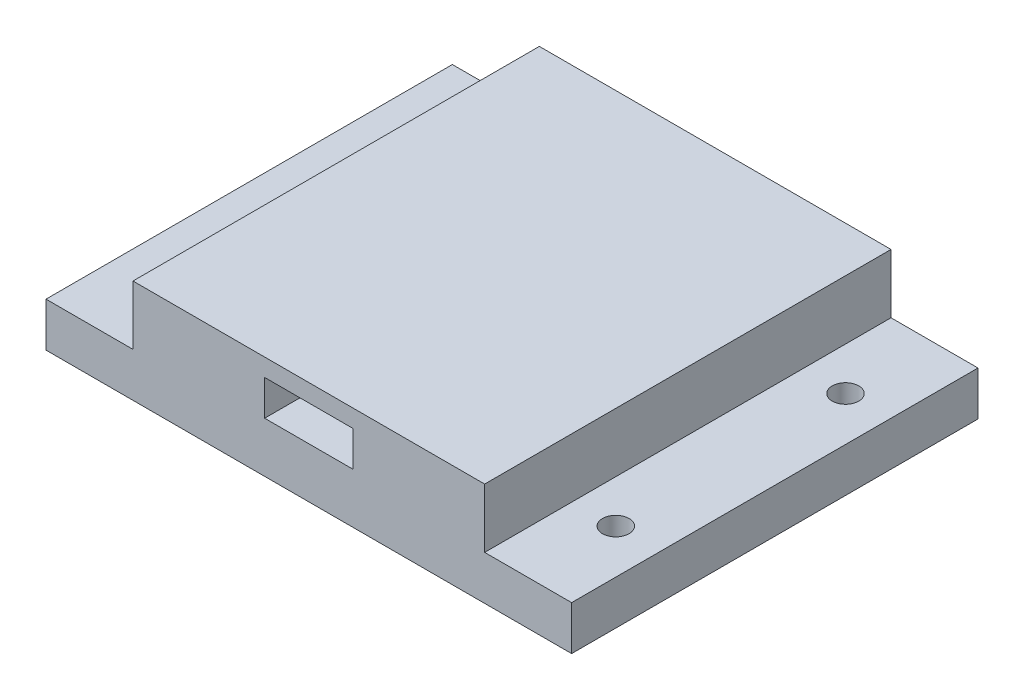
ISO-10303-21;
HEADER;
FILE_DESCRIPTION(('STEP AP214'),'2;1');
FILE_NAME('part.step','',(''),(''),'','','');
FILE_SCHEMA(('AUTOMOTIVE_DESIGN { 1 0 10303 214 1 1 1 1 }'));
ENDSEC;
DATA;
#1=APPLICATION_CONTEXT('core data for automotive mechanical design processes');
#2=APPLICATION_PROTOCOL_DEFINITION('international standard','automotive_design',2000,#1);
#3=PRODUCT_CONTEXT('',#1,'mechanical');
#4=PRODUCT('Part','Part','',(#3));
#5=PRODUCT_RELATED_PRODUCT_CATEGORY('part','',(#4));
#6=PRODUCT_DEFINITION_FORMATION('','',#4);
#7=PRODUCT_DEFINITION_CONTEXT('part definition',#1,'design');
#8=PRODUCT_DEFINITION('design','',#6,#7);
#9=PRODUCT_DEFINITION_SHAPE('','',#8);
#10=(LENGTH_UNIT() NAMED_UNIT(*) SI_UNIT(.MILLI.,.METRE.));
#11=(NAMED_UNIT(*) PLANE_ANGLE_UNIT() SI_UNIT($,.RADIAN.));
#12=(NAMED_UNIT(*) SI_UNIT($,.STERADIAN.) SOLID_ANGLE_UNIT());
#13=UNCERTAINTY_MEASURE_WITH_UNIT(LENGTH_MEASURE(1.E-05),#10,'distance_accuracy_value','');
#14=(GEOMETRIC_REPRESENTATION_CONTEXT(3) GLOBAL_UNCERTAINTY_ASSIGNED_CONTEXT((#13)) GLOBAL_UNIT_ASSIGNED_CONTEXT((#10,
#11,#12)) REPRESENTATION_CONTEXT('',''));
#15=CARTESIAN_POINT('',(0.,0.,0.));
#16=DIRECTION('',(0.,0.,1.));
#17=DIRECTION('',(1.,0.,0.));
#18=AXIS2_PLACEMENT_3D('',#15,#16,#17);
#19=CARTESIAN_POINT('',(0.,5.,0.));
#20=DIRECTION('',(0.,-1.,0.));
#21=DIRECTION('',(0.,0.,-1.));
#22=AXIS2_PLACEMENT_3D('',#19,#20,#21);
#23=PLANE('',#22);
#24=CARTESIAN_POINT('',(24.75,5.,13.));
#25=DIRECTION('',(0.,1.,0.));
#26=DIRECTION('',(0.,0.,-1.));
#27=AXIS2_PLACEMENT_3D('',#24,#25,#26);
#28=CIRCLE('',#27,1.5);
#29=CARTESIAN_POINT('',(24.75,5.,11.5));
#30=VERTEX_POINT('',#29);
#31=EDGE_CURVE('E235',#30,#30,#28,.T.);
#32=ORIENTED_EDGE('',*,*,#31,.F.);
#33=EDGE_LOOP('',(#32));
#34=FACE_BOUND('',#33,.T.);
#35=CARTESIAN_POINT('',(24.75,5.,-13.));
#36=DIRECTION('',(0.,1.,0.));
#37=DIRECTION('',(0.,0.,1.));
#38=AXIS2_PLACEMENT_3D('',#35,#36,#37);
#39=CIRCLE('',#38,1.5);
#40=CARTESIAN_POINT('',(24.75,5.,-11.5));
#41=VERTEX_POINT('',#40);
#42=EDGE_CURVE('E243',#41,#41,#39,.T.);
#43=ORIENTED_EDGE('',*,*,#42,.F.);
#44=EDGE_LOOP('',(#43));
#45=FACE_BOUND('',#44,.T.);
#46=DIRECTION('',(0.,0.,-1.));
#47=VECTOR('',#46,1.);
#48=CARTESIAN_POINT('',(19.905,5.,23.));
#49=LINE('',#48,#47);
#50=CARTESIAN_POINT('',(19.905,5.,23.));
#51=VERTEX_POINT('',#50);
#52=CARTESIAN_POINT('',(19.905,5.,-23.));
#53=VERTEX_POINT('',#52);
#54=EDGE_CURVE('E67',#51,#53,#49,.T.);
#55=ORIENTED_EDGE('',*,*,#54,.F.);
#56=DIRECTION('',(1.,0.,0.));
#57=VECTOR('',#56,1.);
#58=CARTESIAN_POINT('',(-29.75,5.,23.));
#59=LINE('',#58,#57);
#60=CARTESIAN_POINT('',(29.75,5.,23.));
#61=VERTEX_POINT('',#60);
#62=EDGE_CURVE('E263',#51,#61,#59,.T.);
#63=ORIENTED_EDGE('',*,*,#62,.T.);
#64=DIRECTION('',(0.,0.,-1.));
#65=VECTOR('',#64,1.);
#66=CARTESIAN_POINT('',(29.75,5.,23.));
#67=LINE('',#66,#65);
#68=CARTESIAN_POINT('',(29.75,5.,-23.));
#69=VERTEX_POINT('',#68);
#70=EDGE_CURVE('E251',#61,#69,#67,.T.);
#71=ORIENTED_EDGE('',*,*,#70,.T.);
#72=DIRECTION('',(-1.,0.,0.));
#73=VECTOR('',#72,1.);
#74=CARTESIAN_POINT('',(-29.75,5.,-23.));
#75=LINE('',#74,#73);
#76=EDGE_CURVE('E257',#69,#53,#75,.T.);
#77=ORIENTED_EDGE('',*,*,#76,.T.);
#78=EDGE_LOOP('',(#55,#63,#71,#77));
#79=FACE_BOUND('',#78,.T.);
#80=ADVANCED_FACE('F43',(#34,#45,#79),#23,.F.);
#81=CARTESIAN_POINT('',(-24.75,5.,-13.));
#82=DIRECTION('',(0.,1.,0.));
#83=DIRECTION('',(0.,0.,-1.));
#84=AXIS2_PLACEMENT_3D('',#81,#82,#83);
#85=CIRCLE('',#84,1.5);
#86=CARTESIAN_POINT('',(-24.75,5.,-14.5));
#87=VERTEX_POINT('',#86);
#88=EDGE_CURVE('E219',#87,#87,#85,.T.);
#89=ORIENTED_EDGE('',*,*,#88,.F.);
#90=EDGE_LOOP('',(#89));
#91=FACE_BOUND('',#90,.T.);
#92=CARTESIAN_POINT('',(-24.75,5.,13.));
#93=DIRECTION('',(0.,1.,0.));
#94=DIRECTION('',(0.,0.,1.));
#95=AXIS2_PLACEMENT_3D('',#92,#93,#94);
#96=CIRCLE('',#95,1.5);
#97=CARTESIAN_POINT('',(-24.75,5.,14.5));
#98=VERTEX_POINT('',#97);
#99=EDGE_CURVE('E227',#98,#98,#96,.T.);
#100=ORIENTED_EDGE('',*,*,#99,.F.);
#101=EDGE_LOOP('',(#100));
#102=FACE_BOUND('',#101,.T.);
#103=DIRECTION('',(0.,0.,1.));
#104=VECTOR('',#103,1.);
#105=CARTESIAN_POINT('',(-19.905,5.,23.));
#106=LINE('',#105,#104);
#107=CARTESIAN_POINT('',(-19.905,5.,-23.));
#108=VERTEX_POINT('',#107);
#109=CARTESIAN_POINT('',(-19.905,5.,23.));
#110=VERTEX_POINT('',#109);
#111=EDGE_CURVE('E188',#108,#110,#106,.T.);
#112=ORIENTED_EDGE('',*,*,#111,.F.);
#113=CARTESIAN_POINT('',(-29.75,5.,-23.));
#114=VERTEX_POINT('',#113);
#115=EDGE_CURVE('E255',#108,#114,#75,.T.);
#116=ORIENTED_EDGE('',*,*,#115,.T.);
#117=DIRECTION('',(0.,0.,1.));
#118=VECTOR('',#117,1.);
#119=CARTESIAN_POINT('',(-29.75,5.,23.));
#120=LINE('',#119,#118);
#121=CARTESIAN_POINT('',(-29.75,5.,23.));
#122=VERTEX_POINT('',#121);
#123=EDGE_CURVE('E260',#114,#122,#120,.T.);
#124=ORIENTED_EDGE('',*,*,#123,.T.);
#125=EDGE_CURVE('E264',#122,#110,#59,.T.);
#126=ORIENTED_EDGE('',*,*,#125,.T.);
#127=EDGE_LOOP('',(#112,#116,#124,#126));
#128=FACE_BOUND('',#127,.T.);
#129=ADVANCED_FACE('F311',(#91,#102,#128),#23,.F.);
#130=CARTESIAN_POINT('',(0.,0.,0.));
#131=DIRECTION('',(0.,-1.,0.));
#132=DIRECTION('',(0.,0.,-1.));
#133=AXIS2_PLACEMENT_3D('',#130,#131,#132);
#134=PLANE('',#133);
#135=CARTESIAN_POINT('',(-24.75,0.,13.));
#136=DIRECTION('',(0.,1.,0.));
#137=DIRECTION('',(0.,0.,1.));
#138=AXIS2_PLACEMENT_3D('',#135,#136,#137);
#139=CIRCLE('',#138,1.5);
#140=CARTESIAN_POINT('',(-24.75,0.,14.5));
#141=VERTEX_POINT('',#140);
#142=EDGE_CURVE('E223',#141,#141,#139,.T.);
#143=ORIENTED_EDGE('',*,*,#142,.T.);
#144=EDGE_LOOP('',(#143));
#145=FACE_BOUND('',#144,.T.);
#146=CARTESIAN_POINT('',(24.75,0.,-13.));
#147=DIRECTION('',(0.,1.,0.));
#148=DIRECTION('',(0.,0.,1.));
#149=AXIS2_PLACEMENT_3D('',#146,#147,#148);
#150=CIRCLE('',#149,1.5);
#151=CARTESIAN_POINT('',(24.75,0.,-11.5));
#152=VERTEX_POINT('',#151);
#153=EDGE_CURVE('E239',#152,#152,#150,.T.);
#154=ORIENTED_EDGE('',*,*,#153,.T.);
#155=EDGE_LOOP('',(#154));
#156=FACE_BOUND('',#155,.T.);
#157=DIRECTION('',(0.,0.,-1.));
#158=VECTOR('',#157,1.);
#159=CARTESIAN_POINT('',(29.75,0.,23.));
#160=LINE('',#159,#158);
#161=CARTESIAN_POINT('',(29.75,0.,23.));
#162=VERTEX_POINT('',#161);
#163=CARTESIAN_POINT('',(29.75,0.,-23.));
#164=VERTEX_POINT('',#163);
#165=EDGE_CURVE('E247',#162,#164,#160,.T.);
#166=ORIENTED_EDGE('',*,*,#165,.F.);
#167=DIRECTION('',(1.,0.,0.));
#168=VECTOR('',#167,1.);
#169=CARTESIAN_POINT('',(-29.75,0.,23.));
#170=LINE('',#169,#168);
#171=CARTESIAN_POINT('',(-29.75,0.,23.));
#172=VERTEX_POINT('',#171);
#173=EDGE_CURVE('E256',#172,#162,#170,.T.);
#174=ORIENTED_EDGE('',*,*,#173,.F.);
#175=DIRECTION('',(0.,0.,1.));
#176=VECTOR('',#175,1.);
#177=CARTESIAN_POINT('',(-29.75,0.,23.));
#178=LINE('',#177,#176);
#179=CARTESIAN_POINT('',(-29.75,0.,-23.));
#180=VERTEX_POINT('',#179);
#181=EDGE_CURVE('E274',#180,#172,#178,.T.);
#182=ORIENTED_EDGE('',*,*,#181,.F.);
#183=DIRECTION('',(-1.,0.,0.));
#184=VECTOR('',#183,1.);
#185=CARTESIAN_POINT('',(-29.75,0.,-23.));
#186=LINE('',#185,#184);
#187=EDGE_CURVE('E271',#164,#180,#186,.T.);
#188=ORIENTED_EDGE('',*,*,#187,.F.);
#189=EDGE_LOOP('',(#166,#174,#182,#188));
#190=FACE_BOUND('',#189,.T.);
#191=CARTESIAN_POINT('',(24.75,0.,13.));
#192=DIRECTION('',(0.,1.,0.));
#193=DIRECTION('',(0.,0.,-1.));
#194=AXIS2_PLACEMENT_3D('',#191,#192,#193);
#195=CIRCLE('',#194,1.5);
#196=CARTESIAN_POINT('',(24.75,0.,11.5));
#197=VERTEX_POINT('',#196);
#198=EDGE_CURVE('E231',#197,#197,#195,.T.);
#199=ORIENTED_EDGE('',*,*,#198,.T.);
#200=EDGE_LOOP('',(#199));
#201=FACE_BOUND('',#200,.T.);
#202=CARTESIAN_POINT('',(-24.75,0.,-13.));
#203=DIRECTION('',(0.,1.,0.));
#204=DIRECTION('',(0.,0.,-1.));
#205=AXIS2_PLACEMENT_3D('',#202,#203,#204);
#206=CIRCLE('',#205,1.5);
#207=CARTESIAN_POINT('',(-24.75,0.,-14.5));
#208=VERTEX_POINT('',#207);
#209=EDGE_CURVE('E218',#208,#208,#206,.T.);
#210=ORIENTED_EDGE('',*,*,#209,.T.);
#211=EDGE_LOOP('',(#210));
#212=FACE_BOUND('',#211,.T.);
#213=ADVANCED_FACE('F298',(#145,#156,#190,#201,#212),#134,.T.);
#214=CARTESIAN_POINT('',(29.75,5.,23.));
#215=DIRECTION('',(-1.,0.,0.));
#216=DIRECTION('',(0.,0.,1.));
#217=AXIS2_PLACEMENT_3D('',#214,#215,#216);
#218=PLANE('',#217);
#219=ORIENTED_EDGE('',*,*,#165,.T.);
#220=DIRECTION('',(0.,-1.,0.));
#221=VECTOR('',#220,1.);
#222=CARTESIAN_POINT('',(29.75,5.,-23.));
#223=LINE('',#222,#221);
#224=EDGE_CURVE('E11',#69,#164,#223,.T.);
#225=ORIENTED_EDGE('',*,*,#224,.F.);
#226=ORIENTED_EDGE('',*,*,#70,.F.);
#227=DIRECTION('',(0.,-1.,0.));
#228=VECTOR('',#227,1.);
#229=CARTESIAN_POINT('',(29.75,5.,23.));
#230=LINE('',#229,#228);
#231=EDGE_CURVE('E267',#61,#162,#230,.T.);
#232=ORIENTED_EDGE('',*,*,#231,.T.);
#233=EDGE_LOOP('',(#219,#225,#226,#232));
#234=FACE_BOUND('',#233,.T.);
#235=ADVANCED_FACE('F45',(#234),#218,.F.);
#236=CARTESIAN_POINT('',(-29.75,5.,-23.));
#237=DIRECTION('',(0.,0.,1.));
#238=DIRECTION('',(1.,0.,0.));
#239=AXIS2_PLACEMENT_3D('',#236,#237,#238);
#240=PLANE('',#239);
#241=ORIENTED_EDGE('',*,*,#187,.T.);
#242=DIRECTION('',(0.,-1.,0.));
#243=VECTOR('',#242,1.);
#244=CARTESIAN_POINT('',(-29.75,5.,-23.));
#245=LINE('',#244,#243);
#246=EDGE_CURVE('E52',#114,#180,#245,.T.);
#247=ORIENTED_EDGE('',*,*,#246,.F.);
#248=ORIENTED_EDGE('',*,*,#115,.F.);
#249=DIRECTION('',(0.,-1.,0.));
#250=VECTOR('',#249,1.);
#251=CARTESIAN_POINT('',(-19.905,11.7,-23.));
#252=LINE('',#251,#250);
#253=CARTESIAN_POINT('',(-19.905,11.7,-23.));
#254=VERTEX_POINT('',#253);
#255=EDGE_CURVE('E210',#254,#108,#252,.T.);
#256=ORIENTED_EDGE('',*,*,#255,.F.);
#257=DIRECTION('',(-1.,0.,0.));
#258=VECTOR('',#257,1.);
#259=CARTESIAN_POINT('',(-19.905,11.7,-23.));
#260=LINE('',#259,#258);
#261=CARTESIAN_POINT('',(19.905,11.7,-23.));
#262=VERTEX_POINT('',#261);
#263=EDGE_CURVE('E187',#262,#254,#260,.T.);
#264=ORIENTED_EDGE('',*,*,#263,.F.);
#265=DIRECTION('',(0.,-1.,0.));
#266=VECTOR('',#265,1.);
#267=CARTESIAN_POINT('',(19.905,11.7,-23.));
#268=LINE('',#267,#266);
#269=EDGE_CURVE('E214',#262,#53,#268,.T.);
#270=ORIENTED_EDGE('',*,*,#269,.T.);
#271=ORIENTED_EDGE('',*,*,#76,.F.);
#272=ORIENTED_EDGE('',*,*,#224,.T.);
#273=EDGE_LOOP('',(#241,#247,#248,#256,#264,#270,#271,#272));
#274=FACE_BOUND('',#273,.T.);
#275=ADVANCED_FACE('F313',(#274),#240,.F.);
#276=CARTESIAN_POINT('',(-29.75,5.,23.));
#277=DIRECTION('',(1.,0.,0.));
#278=DIRECTION('',(0.,0.,-1.));
#279=AXIS2_PLACEMENT_3D('',#276,#277,#278);
#280=PLANE('',#279);
#281=ORIENTED_EDGE('',*,*,#181,.T.);
#282=DIRECTION('',(0.,-1.,0.));
#283=VECTOR('',#282,1.);
#284=CARTESIAN_POINT('',(-29.75,5.,23.));
#285=LINE('',#284,#283);
#286=EDGE_CURVE('E282',#122,#172,#285,.T.);
#287=ORIENTED_EDGE('',*,*,#286,.F.);
#288=ORIENTED_EDGE('',*,*,#123,.F.);
#289=ORIENTED_EDGE('',*,*,#246,.T.);
#290=EDGE_LOOP('',(#281,#287,#288,#289));
#291=FACE_BOUND('',#290,.T.);
#292=ADVANCED_FACE('F291',(#291),#280,.F.);
#293=CARTESIAN_POINT('',(-29.75,5.,23.));
#294=DIRECTION('',(0.,0.,-1.));
#295=DIRECTION('',(-1.,0.,0.));
#296=AXIS2_PLACEMENT_3D('',#293,#294,#295);
#297=PLANE('',#296);
#298=DIRECTION('',(-1.,0.,0.));
#299=VECTOR('',#298,1.);
#300=CARTESIAN_POINT('',(-5.,9.7,23.));
#301=LINE('',#300,#299);
#302=CARTESIAN_POINT('',(5.,9.7,23.));
#303=VERTEX_POINT('',#302);
#304=CARTESIAN_POINT('',(-5.,9.7,23.));
#305=VERTEX_POINT('',#304);
#306=EDGE_CURVE('E169',#303,#305,#301,.T.);
#307=ORIENTED_EDGE('',*,*,#306,.F.);
#308=DIRECTION('',(0.,1.,0.));
#309=VECTOR('',#308,1.);
#310=CARTESIAN_POINT('',(5.,5.7,23.));
#311=LINE('',#310,#309);
#312=CARTESIAN_POINT('',(5.,5.7,23.));
#313=VERTEX_POINT('',#312);
#314=EDGE_CURVE('E59',#313,#303,#311,.T.);
#315=ORIENTED_EDGE('',*,*,#314,.F.);
#316=DIRECTION('',(1.,0.,0.));
#317=VECTOR('',#316,1.);
#318=CARTESIAN_POINT('',(-5.,5.7,23.));
#319=LINE('',#318,#317);
#320=CARTESIAN_POINT('',(-5.,5.7,23.));
#321=VERTEX_POINT('',#320);
#322=EDGE_CURVE('E156',#321,#313,#319,.T.);
#323=ORIENTED_EDGE('',*,*,#322,.F.);
#324=DIRECTION('',(0.,-1.,0.));
#325=VECTOR('',#324,1.);
#326=CARTESIAN_POINT('',(-5.,5.7,23.));
#327=LINE('',#326,#325);
#328=EDGE_CURVE('E160',#305,#321,#327,.T.);
#329=ORIENTED_EDGE('',*,*,#328,.F.);
#330=EDGE_LOOP('',(#307,#315,#323,#329));
#331=FACE_BOUND('',#330,.T.);
#332=ORIENTED_EDGE('',*,*,#173,.T.);
#333=ORIENTED_EDGE('',*,*,#231,.F.);
#334=ORIENTED_EDGE('',*,*,#62,.F.);
#335=DIRECTION('',(0.,-1.,0.));
#336=VECTOR('',#335,1.);
#337=CARTESIAN_POINT('',(19.905,11.7,23.));
#338=LINE('',#337,#336);
#339=CARTESIAN_POINT('',(19.905,11.7,23.));
#340=VERTEX_POINT('',#339);
#341=EDGE_CURVE('E197',#340,#51,#338,.T.);
#342=ORIENTED_EDGE('',*,*,#341,.F.);
#343=DIRECTION('',(1.,0.,0.));
#344=VECTOR('',#343,1.);
#345=CARTESIAN_POINT('',(-19.905,11.7,23.));
#346=LINE('',#345,#344);
#347=CARTESIAN_POINT('',(-19.905,11.7,23.));
#348=VERTEX_POINT('',#347);
#349=EDGE_CURVE('E194',#348,#340,#346,.T.);
#350=ORIENTED_EDGE('',*,*,#349,.F.);
#351=DIRECTION('',(0.,-1.,0.));
#352=VECTOR('',#351,1.);
#353=CARTESIAN_POINT('',(-19.905,11.7,23.));
#354=LINE('',#353,#352);
#355=EDGE_CURVE('E206',#348,#110,#354,.T.);
#356=ORIENTED_EDGE('',*,*,#355,.T.);
#357=ORIENTED_EDGE('',*,*,#125,.F.);
#358=ORIENTED_EDGE('',*,*,#286,.T.);
#359=EDGE_LOOP('',(#332,#333,#334,#342,#350,#356,#357,#358));
#360=FACE_BOUND('',#359,.T.);
#361=ADVANCED_FACE('F302',(#331,#360),#297,.F.);
#362=CARTESIAN_POINT('',(24.75,5.,-13.));
#363=DIRECTION('',(0.,-1.,0.));
#364=DIRECTION('',(0.,0.,-1.));
#365=AXIS2_PLACEMENT_3D('',#362,#363,#364);
#366=CYLINDRICAL_SURFACE('',#365,1.5);
#367=ORIENTED_EDGE('',*,*,#42,.T.);
#368=EDGE_LOOP('',(#367));
#369=FACE_BOUND('',#368,.T.);
#370=ORIENTED_EDGE('',*,*,#153,.F.);
#371=EDGE_LOOP('',(#370));
#372=FACE_BOUND('',#371,.T.);
#373=ADVANCED_FACE('F347',(#369,#372),#366,.F.);
#374=CARTESIAN_POINT('',(24.75,5.,13.));
#375=DIRECTION('',(0.,-1.,0.));
#376=DIRECTION('',(0.,0.,-1.));
#377=AXIS2_PLACEMENT_3D('',#374,#375,#376);
#378=CYLINDRICAL_SURFACE('',#377,1.5);
#379=ORIENTED_EDGE('',*,*,#31,.T.);
#380=EDGE_LOOP('',(#379));
#381=FACE_BOUND('',#380,.T.);
#382=ORIENTED_EDGE('',*,*,#198,.F.);
#383=EDGE_LOOP('',(#382));
#384=FACE_BOUND('',#383,.T.);
#385=ADVANCED_FACE('F488',(#381,#384),#378,.F.);
#386=CARTESIAN_POINT('',(-24.75,5.,13.));
#387=DIRECTION('',(0.,-1.,0.));
#388=DIRECTION('',(0.,0.,-1.));
#389=AXIS2_PLACEMENT_3D('',#386,#387,#388);
#390=CYLINDRICAL_SURFACE('',#389,1.5);
#391=ORIENTED_EDGE('',*,*,#99,.T.);
#392=EDGE_LOOP('',(#391));
#393=FACE_BOUND('',#392,.T.);
#394=ORIENTED_EDGE('',*,*,#142,.F.);
#395=EDGE_LOOP('',(#394));
#396=FACE_BOUND('',#395,.T.);
#397=ADVANCED_FACE('F333',(#393,#396),#390,.F.);
#398=CARTESIAN_POINT('',(-24.75,5.,-13.));
#399=DIRECTION('',(0.,-1.,0.));
#400=DIRECTION('',(0.,0.,-1.));
#401=AXIS2_PLACEMENT_3D('',#398,#399,#400);
#402=CYLINDRICAL_SURFACE('',#401,1.5);
#403=ORIENTED_EDGE('',*,*,#88,.T.);
#404=EDGE_LOOP('',(#403));
#405=FACE_BOUND('',#404,.T.);
#406=ORIENTED_EDGE('',*,*,#209,.F.);
#407=EDGE_LOOP('',(#406));
#408=FACE_BOUND('',#407,.T.);
#409=ADVANCED_FACE('F326',(#405,#408),#402,.F.);
#410=CARTESIAN_POINT('',(19.905,11.7,23.));
#411=DIRECTION('',(-1.,0.,0.));
#412=DIRECTION('',(0.,0.,1.));
#413=AXIS2_PLACEMENT_3D('',#410,#411,#412);
#414=PLANE('',#413);
#415=ORIENTED_EDGE('',*,*,#54,.T.);
#416=ORIENTED_EDGE('',*,*,#269,.F.);
#417=DIRECTION('',(0.,0.,-1.));
#418=VECTOR('',#417,1.);
#419=CARTESIAN_POINT('',(19.905,11.7,23.));
#420=LINE('',#419,#418);
#421=EDGE_CURVE('E183',#340,#262,#420,.T.);
#422=ORIENTED_EDGE('',*,*,#421,.F.);
#423=ORIENTED_EDGE('',*,*,#341,.T.);
#424=EDGE_LOOP('',(#415,#416,#422,#423));
#425=FACE_BOUND('',#424,.T.);
#426=ADVANCED_FACE('F324',(#425),#414,.F.);
#427=CARTESIAN_POINT('',(-19.905,11.7,23.));
#428=DIRECTION('',(1.,0.,0.));
#429=DIRECTION('',(0.,0.,-1.));
#430=AXIS2_PLACEMENT_3D('',#427,#428,#429);
#431=PLANE('',#430);
#432=ORIENTED_EDGE('',*,*,#111,.T.);
#433=ORIENTED_EDGE('',*,*,#355,.F.);
#434=DIRECTION('',(0.,0.,1.));
#435=VECTOR('',#434,1.);
#436=CARTESIAN_POINT('',(-19.905,11.7,23.));
#437=LINE('',#436,#435);
#438=EDGE_CURVE('E191',#254,#348,#437,.T.);
#439=ORIENTED_EDGE('',*,*,#438,.F.);
#440=ORIENTED_EDGE('',*,*,#255,.T.);
#441=EDGE_LOOP('',(#432,#433,#439,#440));
#442=FACE_BOUND('',#441,.T.);
#443=ADVANCED_FACE('F316',(#442),#431,.F.);
#444=CARTESIAN_POINT('',(0.,11.7,0.));
#445=DIRECTION('',(0.,-1.,0.));
#446=DIRECTION('',(0.,0.,-1.));
#447=AXIS2_PLACEMENT_3D('',#444,#445,#446);
#448=PLANE('',#447);
#449=ORIENTED_EDGE('',*,*,#421,.T.);
#450=ORIENTED_EDGE('',*,*,#263,.T.);
#451=ORIENTED_EDGE('',*,*,#438,.T.);
#452=ORIENTED_EDGE('',*,*,#349,.T.);
#453=EDGE_LOOP('',(#449,#450,#451,#452));
#454=FACE_BOUND('',#453,.T.);
#455=ADVANCED_FACE('F320',(#454),#448,.F.);
#456=CARTESIAN_POINT('',(5.,5.7,16.3));
#457=DIRECTION('',(1.,0.,0.));
#458=DIRECTION('',(0.,0.,-1.));
#459=AXIS2_PLACEMENT_3D('',#456,#457,#458);
#460=PLANE('',#459);
#461=ORIENTED_EDGE('',*,*,#314,.T.);
#462=DIRECTION('',(0.,0.,1.));
#463=VECTOR('',#462,1.);
#464=CARTESIAN_POINT('',(5.,9.7,16.3));
#465=LINE('',#464,#463);
#466=CARTESIAN_POINT('',(5.,9.7,16.3));
#467=VERTEX_POINT('',#466);
#468=EDGE_CURVE('E131',#467,#303,#465,.T.);
#469=ORIENTED_EDGE('',*,*,#468,.F.);
#470=DIRECTION('',(0.,1.,0.));
#471=VECTOR('',#470,1.);
#472=CARTESIAN_POINT('',(5.,5.7,16.3));
#473=LINE('',#472,#471);
#474=CARTESIAN_POINT('',(5.,5.7,16.3));
#475=VERTEX_POINT('',#474);
#476=EDGE_CURVE('E135',#475,#467,#473,.T.);
#477=ORIENTED_EDGE('',*,*,#476,.F.);
#478=DIRECTION('',(0.,0.,1.));
#479=VECTOR('',#478,1.);
#480=CARTESIAN_POINT('',(5.,5.7,16.3));
#481=LINE('',#480,#479);
#482=EDGE_CURVE('E175',#475,#313,#481,.T.);
#483=ORIENTED_EDGE('',*,*,#482,.T.);
#484=EDGE_LOOP('',(#461,#469,#477,#483));
#485=FACE_BOUND('',#484,.T.);
#486=ADVANCED_FACE('F133',(#485),#460,.F.);
#487=CARTESIAN_POINT('',(-5.,5.7,16.3));
#488=DIRECTION('',(0.,-1.,0.));
#489=DIRECTION('',(0.,0.,-1.));
#490=AXIS2_PLACEMENT_3D('',#487,#488,#489);
#491=PLANE('',#490);
#492=ORIENTED_EDGE('',*,*,#322,.T.);
#493=ORIENTED_EDGE('',*,*,#482,.F.);
#494=DIRECTION('',(1.,0.,0.));
#495=VECTOR('',#494,1.);
#496=CARTESIAN_POINT('',(-5.,5.7,16.3));
#497=LINE('',#496,#495);
#498=CARTESIAN_POINT('',(-5.,5.7,16.3));
#499=VERTEX_POINT('',#498);
#500=EDGE_CURVE('E142',#499,#475,#497,.T.);
#501=ORIENTED_EDGE('',*,*,#500,.F.);
#502=DIRECTION('',(0.,0.,1.));
#503=VECTOR('',#502,1.);
#504=CARTESIAN_POINT('',(-5.,5.7,16.3));
#505=LINE('',#504,#503);
#506=EDGE_CURVE('E178',#499,#321,#505,.T.);
#507=ORIENTED_EDGE('',*,*,#506,.T.);
#508=EDGE_LOOP('',(#492,#493,#501,#507));
#509=FACE_BOUND('',#508,.T.);
#510=ADVANCED_FACE('F419',(#509),#491,.F.);
#511=CARTESIAN_POINT('',(-5.,5.7,16.3));
#512=DIRECTION('',(-1.,0.,0.));
#513=DIRECTION('',(0.,0.,1.));
#514=AXIS2_PLACEMENT_3D('',#511,#512,#513);
#515=PLANE('',#514);
#516=ORIENTED_EDGE('',*,*,#328,.T.);
#517=ORIENTED_EDGE('',*,*,#506,.F.);
#518=DIRECTION('',(0.,-1.,0.));
#519=VECTOR('',#518,1.);
#520=CARTESIAN_POINT('',(-5.,5.7,16.3));
#521=LINE('',#520,#519);
#522=CARTESIAN_POINT('',(-5.,9.7,16.3));
#523=VERTEX_POINT('',#522);
#524=EDGE_CURVE('E151',#523,#499,#521,.T.);
#525=ORIENTED_EDGE('',*,*,#524,.F.);
#526=DIRECTION('',(0.,0.,1.));
#527=VECTOR('',#526,1.);
#528=CARTESIAN_POINT('',(-5.,9.7,16.3));
#529=LINE('',#528,#527);
#530=EDGE_CURVE('E141',#523,#305,#529,.T.);
#531=ORIENTED_EDGE('',*,*,#530,.T.);
#532=EDGE_LOOP('',(#516,#517,#525,#531));
#533=FACE_BOUND('',#532,.T.);
#534=ADVANCED_FACE('F429',(#533),#515,.F.);
#535=CARTESIAN_POINT('',(-5.,9.7,16.3));
#536=DIRECTION('',(0.,1.,0.));
#537=DIRECTION('',(0.,0.,1.));
#538=AXIS2_PLACEMENT_3D('',#535,#536,#537);
#539=PLANE('',#538);
#540=ORIENTED_EDGE('',*,*,#306,.T.);
#541=ORIENTED_EDGE('',*,*,#530,.F.);
#542=DIRECTION('',(-1.,0.,0.));
#543=VECTOR('',#542,1.);
#544=CARTESIAN_POINT('',(-5.,9.7,16.3));
#545=LINE('',#544,#543);
#546=EDGE_CURVE('E145',#467,#523,#545,.T.);
#547=ORIENTED_EDGE('',*,*,#546,.F.);
#548=ORIENTED_EDGE('',*,*,#468,.T.);
#549=EDGE_LOOP('',(#540,#541,#547,#548));
#550=FACE_BOUND('',#549,.T.);
#551=ADVANCED_FACE('F146',(#550),#539,.F.);
#552=CARTESIAN_POINT('',(0.,0.,16.3));
#553=DIRECTION('',(0.,0.,-1.));
#554=DIRECTION('',(-1.,0.,0.));
#555=AXIS2_PLACEMENT_3D('',#552,#553,#554);
#556=PLANE('',#555);
#557=ORIENTED_EDGE('',*,*,#476,.T.);
#558=ORIENTED_EDGE('',*,*,#546,.T.);
#559=ORIENTED_EDGE('',*,*,#524,.T.);
#560=ORIENTED_EDGE('',*,*,#500,.T.);
#561=EDGE_LOOP('',(#557,#558,#559,#560));
#562=FACE_BOUND('',#561,.T.);
#563=ADVANCED_FACE('F153',(#562),#556,.F.);
#564=CLOSED_SHELL('',(#80,#129,#213,#235,#275,#292,#361,#373,#385,#397,#409,#426,#443,#455,#486,
#510,#534,#551,#563));
#565=MANIFOLD_SOLID_BREP('B2',#564);
#566=ADVANCED_BREP_SHAPE_REPRESENTATION('',(#18,#565),#14);
#567=SHAPE_DEFINITION_REPRESENTATION(#9,#566);
ENDSEC;
END-ISO-10303-21;
